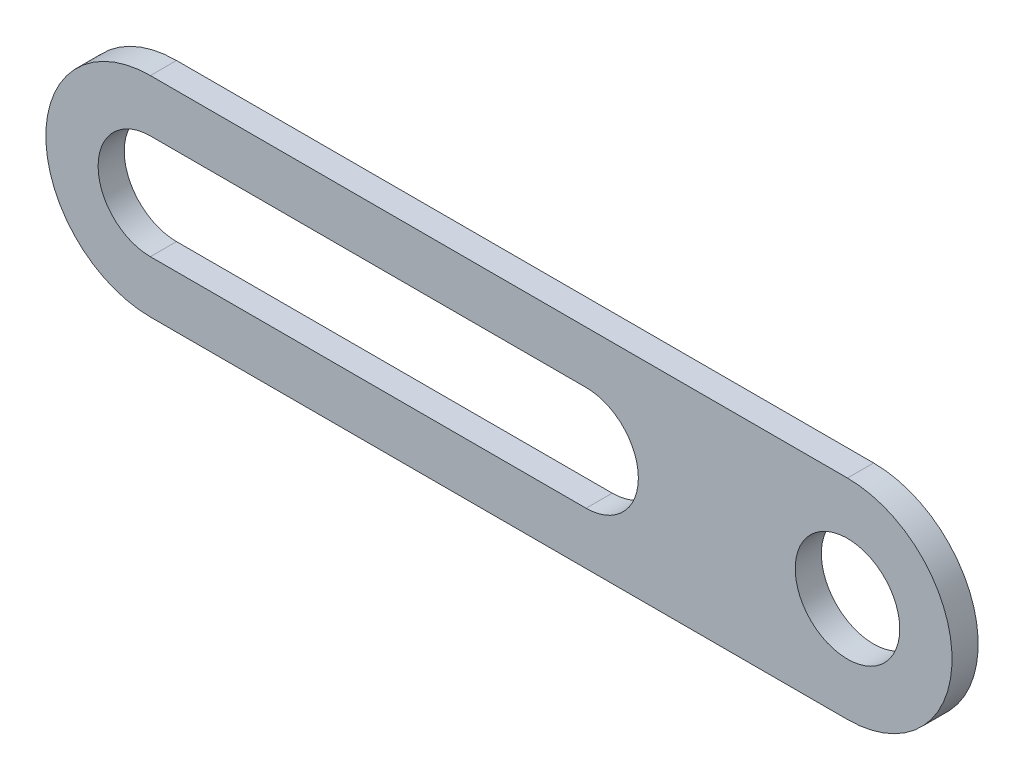
ISO-10303-21;
HEADER;
FILE_DESCRIPTION(('STEP AP214'),'2;1');
FILE_NAME('part.step','',(''),(''),'','','');
FILE_SCHEMA(('AUTOMOTIVE_DESIGN { 1 0 10303 214 1 1 1 1 }'));
ENDSEC;
DATA;
#1=APPLICATION_CONTEXT('core data for automotive mechanical design processes');
#2=APPLICATION_PROTOCOL_DEFINITION('international standard','automotive_design',2000,#1);
#3=PRODUCT_CONTEXT('',#1,'mechanical');
#4=PRODUCT('Part','Part','',(#3));
#5=PRODUCT_RELATED_PRODUCT_CATEGORY('part','',(#4));
#6=PRODUCT_DEFINITION_FORMATION('','',#4);
#7=PRODUCT_DEFINITION_CONTEXT('part definition',#1,'design');
#8=PRODUCT_DEFINITION('design','',#6,#7);
#9=PRODUCT_DEFINITION_SHAPE('','',#8);
#10=(LENGTH_UNIT() NAMED_UNIT(*) SI_UNIT(.MILLI.,.METRE.));
#11=(NAMED_UNIT(*) PLANE_ANGLE_UNIT() SI_UNIT($,.RADIAN.));
#12=(NAMED_UNIT(*) SI_UNIT($,.STERADIAN.) SOLID_ANGLE_UNIT());
#13=UNCERTAINTY_MEASURE_WITH_UNIT(LENGTH_MEASURE(1.E-05),#10,'distance_accuracy_value','');
#14=(GEOMETRIC_REPRESENTATION_CONTEXT(3) GLOBAL_UNCERTAINTY_ASSIGNED_CONTEXT((#13)) GLOBAL_UNIT_ASSIGNED_CONTEXT((#10,
#11,#12)) REPRESENTATION_CONTEXT('',''));
#15=CARTESIAN_POINT('',(0.,0.,0.));
#16=DIRECTION('',(0.,0.,1.));
#17=DIRECTION('',(1.,0.,0.));
#18=AXIS2_PLACEMENT_3D('',#15,#16,#17);
#19=CARTESIAN_POINT('',(-69.3749999999997,-2.43750000000005,3.));
#20=DIRECTION('',(0.,0.,1.));
#21=DIRECTION('',(1.,0.,0.));
#22=AXIS2_PLACEMENT_3D('',#19,#20,#21);
#23=PLANE('',#22);
#24=CARTESIAN_POINT('',(-69.3749999999997,-2.43750000000005,3.));
#25=DIRECTION('',(0.,0.,1.));
#26=DIRECTION('',(1.,0.,0.));
#27=AXIS2_PLACEMENT_3D('',#24,#25,#26);
#28=CIRCLE('',#27,12.);
#29=CARTESIAN_POINT('',(-69.3749999999997,9.56249999999995,3.));
#30=VERTEX_POINT('',#29);
#31=CARTESIAN_POINT('',(-69.3749999999997,-14.4375,3.));
#32=VERTEX_POINT('',#31);
#33=EDGE_CURVE('E140',#30,#32,#28,.T.);
#34=ORIENTED_EDGE('',*,*,#33,.T.);
#35=DIRECTION('',(1.,0.,0.));
#36=VECTOR('',#35,1.);
#37=CARTESIAN_POINT('',(10.6250000000003,-14.4375,3.));
#38=LINE('',#37,#36);
#39=CARTESIAN_POINT('',(10.6250000000003,-14.4375,3.));
#40=VERTEX_POINT('',#39);
#41=EDGE_CURVE('E143',#32,#40,#38,.T.);
#42=ORIENTED_EDGE('',*,*,#41,.T.);
#43=CARTESIAN_POINT('',(10.6250000000003,-2.43750000000005,3.));
#44=DIRECTION('',(0.,0.,1.));
#45=DIRECTION('',(1.,0.,0.));
#46=AXIS2_PLACEMENT_3D('',#43,#44,#45);
#47=CIRCLE('',#46,12.);
#48=CARTESIAN_POINT('',(10.6250000000003,9.56249999999995,3.));
#49=VERTEX_POINT('',#48);
#50=EDGE_CURVE('E146',#40,#49,#47,.T.);
#51=ORIENTED_EDGE('',*,*,#50,.T.);
#52=DIRECTION('',(-1.,0.,0.));
#53=VECTOR('',#52,1.);
#54=CARTESIAN_POINT('',(-69.3749999999997,9.56249999999995,3.));
#55=LINE('',#54,#53);
#56=EDGE_CURVE('E148',#49,#30,#55,.T.);
#57=ORIENTED_EDGE('',*,*,#56,.T.);
#58=EDGE_LOOP('',(#34,#42,#51,#57));
#59=FACE_BOUND('',#58,.T.);
#60=CARTESIAN_POINT('',(10.6250000000003,-2.43750000000005,3.));
#61=DIRECTION('',(0.,0.,1.));
#62=DIRECTION('',(1.,0.,0.));
#63=AXIS2_PLACEMENT_3D('',#60,#61,#62);
#64=CIRCLE('',#63,5.99999999999999);
#65=CARTESIAN_POINT('',(16.6250000000003,-2.43750000000005,3.));
#66=VERTEX_POINT('',#65);
#67=EDGE_CURVE('E134',#66,#66,#64,.T.);
#68=ORIENTED_EDGE('',*,*,#67,.F.);
#69=EDGE_LOOP('',(#68));
#70=FACE_BOUND('',#69,.T.);
#71=DIRECTION('',(1.,0.,0.));
#72=VECTOR('',#71,1.);
#73=CARTESIAN_POINT('',(-69.3749999999997,-8.43750000000005,3.));
#74=LINE('',#73,#72);
#75=CARTESIAN_POINT('',(-69.3749999999997,-8.43750000000005,3.));
#76=VERTEX_POINT('',#75);
#77=CARTESIAN_POINT('',(-19.3749999999997,-8.43750000000005,3.));
#78=VERTEX_POINT('',#77);
#79=EDGE_CURVE('E106',#76,#78,#74,.T.);
#80=ORIENTED_EDGE('',*,*,#79,.F.);
#81=CARTESIAN_POINT('',(-69.3749999999997,-2.43750000000005,3.));
#82=DIRECTION('',(0.,0.,1.));
#83=DIRECTION('',(1.,0.,0.));
#84=AXIS2_PLACEMENT_3D('',#81,#82,#83);
#85=CIRCLE('',#84,6.);
#86=CARTESIAN_POINT('',(-69.3749999999997,3.56249999999995,3.));
#87=VERTEX_POINT('',#86);
#88=EDGE_CURVE('E98',#87,#76,#85,.T.);
#89=ORIENTED_EDGE('',*,*,#88,.F.);
#90=DIRECTION('',(-1.,0.,0.));
#91=VECTOR('',#90,1.);
#92=CARTESIAN_POINT('',(-69.3749999999997,3.56249999999995,3.));
#93=LINE('',#92,#91);
#94=CARTESIAN_POINT('',(-19.3749999999997,3.56249999999995,3.));
#95=VERTEX_POINT('',#94);
#96=EDGE_CURVE('E120',#95,#87,#93,.T.);
#97=ORIENTED_EDGE('',*,*,#96,.F.);
#98=CARTESIAN_POINT('',(-19.3749999999997,-2.43750000000005,3.));
#99=DIRECTION('',(0.,0.,1.));
#100=DIRECTION('',(-1.,0.,0.));
#101=AXIS2_PLACEMENT_3D('',#98,#99,#100);
#102=CIRCLE('',#101,6.);
#103=EDGE_CURVE('E118',#78,#95,#102,.T.);
#104=ORIENTED_EDGE('',*,*,#103,.F.);
#105=EDGE_LOOP('',(#80,#89,#97,#104));
#106=FACE_BOUND('',#105,.T.);
#107=ADVANCED_FACE('F33',(#59,#70,#106),#23,.T.);
#108=CARTESIAN_POINT('',(-69.3749999999997,-2.43750000000005,0.));
#109=DIRECTION('',(0.,0.,1.));
#110=DIRECTION('',(1.,0.,0.));
#111=AXIS2_PLACEMENT_3D('',#108,#109,#110);
#112=PLANE('',#111);
#113=CARTESIAN_POINT('',(10.6250000000003,-2.43750000000005,0.));
#114=DIRECTION('',(0.,0.,1.));
#115=DIRECTION('',(1.,0.,0.));
#116=AXIS2_PLACEMENT_3D('',#113,#114,#115);
#117=CIRCLE('',#116,5.99999999999999);
#118=CARTESIAN_POINT('',(16.6250000000003,-2.43750000000005,0.));
#119=VERTEX_POINT('',#118);
#120=EDGE_CURVE('E114',#119,#119,#117,.T.);
#121=ORIENTED_EDGE('',*,*,#120,.T.);
#122=EDGE_LOOP('',(#121));
#123=FACE_BOUND('',#122,.T.);
#124=CARTESIAN_POINT('',(-69.3749999999997,-2.43750000000005,0.));
#125=DIRECTION('',(0.,0.,1.));
#126=DIRECTION('',(1.,0.,0.));
#127=AXIS2_PLACEMENT_3D('',#124,#125,#126);
#128=CIRCLE('',#127,12.);
#129=CARTESIAN_POINT('',(-69.3749999999997,9.56249999999995,0.));
#130=VERTEX_POINT('',#129);
#131=CARTESIAN_POINT('',(-69.3749999999997,-14.4375,0.));
#132=VERTEX_POINT('',#131);
#133=EDGE_CURVE('E137',#130,#132,#128,.T.);
#134=ORIENTED_EDGE('',*,*,#133,.F.);
#135=DIRECTION('',(-1.,0.,0.));
#136=VECTOR('',#135,1.);
#137=CARTESIAN_POINT('',(-69.3749999999997,9.56249999999995,0.));
#138=LINE('',#137,#136);
#139=CARTESIAN_POINT('',(10.6250000000003,9.56249999999995,0.));
#140=VERTEX_POINT('',#139);
#141=EDGE_CURVE('E144',#140,#130,#138,.T.);
#142=ORIENTED_EDGE('',*,*,#141,.F.);
#143=CARTESIAN_POINT('',(10.6250000000003,-2.43750000000005,0.));
#144=DIRECTION('',(0.,0.,1.));
#145=DIRECTION('',(1.,0.,0.));
#146=AXIS2_PLACEMENT_3D('',#143,#144,#145);
#147=CIRCLE('',#146,12.);
#148=CARTESIAN_POINT('',(10.6250000000003,-14.4375,0.));
#149=VERTEX_POINT('',#148);
#150=EDGE_CURVE('E155',#149,#140,#147,.T.);
#151=ORIENTED_EDGE('',*,*,#150,.F.);
#152=DIRECTION('',(1.,0.,0.));
#153=VECTOR('',#152,1.);
#154=CARTESIAN_POINT('',(10.6250000000003,-14.4375,0.));
#155=LINE('',#154,#153);
#156=EDGE_CURVE('E153',#132,#149,#155,.T.);
#157=ORIENTED_EDGE('',*,*,#156,.F.);
#158=EDGE_LOOP('',(#134,#142,#151,#157));
#159=FACE_BOUND('',#158,.T.);
#160=CARTESIAN_POINT('',(-69.3749999999997,-2.43750000000005,0.));
#161=DIRECTION('',(0.,0.,1.));
#162=DIRECTION('',(1.,0.,0.));
#163=AXIS2_PLACEMENT_3D('',#160,#161,#162);
#164=CIRCLE('',#163,6.);
#165=CARTESIAN_POINT('',(-69.3749999999997,3.56249999999995,0.));
#166=VERTEX_POINT('',#165);
#167=CARTESIAN_POINT('',(-69.3749999999997,-8.43750000000005,0.));
#168=VERTEX_POINT('',#167);
#169=EDGE_CURVE('E56',#166,#168,#164,.T.);
#170=ORIENTED_EDGE('',*,*,#169,.T.);
#171=DIRECTION('',(1.,0.,0.));
#172=VECTOR('',#171,1.);
#173=CARTESIAN_POINT('',(-69.3749999999997,-8.43750000000005,0.));
#174=LINE('',#173,#172);
#175=CARTESIAN_POINT('',(-19.3749999999997,-8.43750000000005,0.));
#176=VERTEX_POINT('',#175);
#177=EDGE_CURVE('E113',#168,#176,#174,.T.);
#178=ORIENTED_EDGE('',*,*,#177,.T.);
#179=CARTESIAN_POINT('',(-19.3749999999997,-2.43750000000005,0.));
#180=DIRECTION('',(0.,0.,1.));
#181=DIRECTION('',(-1.,0.,0.));
#182=AXIS2_PLACEMENT_3D('',#179,#180,#181);
#183=CIRCLE('',#182,6.);
#184=CARTESIAN_POINT('',(-19.3749999999997,3.56249999999995,0.));
#185=VERTEX_POINT('',#184);
#186=EDGE_CURVE('E126',#176,#185,#183,.T.);
#187=ORIENTED_EDGE('',*,*,#186,.T.);
#188=DIRECTION('',(-1.,0.,0.));
#189=VECTOR('',#188,1.);
#190=CARTESIAN_POINT('',(-69.3749999999997,3.56249999999995,0.));
#191=LINE('',#190,#189);
#192=EDGE_CURVE('E107',#185,#166,#191,.T.);
#193=ORIENTED_EDGE('',*,*,#192,.T.);
#194=EDGE_LOOP('',(#170,#178,#187,#193));
#195=FACE_BOUND('',#194,.T.);
#196=ADVANCED_FACE('F173',(#123,#159,#195),#112,.F.);
#197=CARTESIAN_POINT('',(-69.3749999999997,-2.43750000000005,3.));
#198=DIRECTION('',(0.,0.,-1.));
#199=DIRECTION('',(-1.,0.,0.));
#200=AXIS2_PLACEMENT_3D('',#197,#198,#199);
#201=CYLINDRICAL_SURFACE('',#200,12.);
#202=ORIENTED_EDGE('',*,*,#133,.T.);
#203=DIRECTION('',(0.,0.,-1.));
#204=VECTOR('',#203,1.);
#205=CARTESIAN_POINT('',(-69.3749999999997,-14.4375,3.));
#206=LINE('',#205,#204);
#207=EDGE_CURVE('E11',#32,#132,#206,.T.);
#208=ORIENTED_EDGE('',*,*,#207,.F.);
#209=ORIENTED_EDGE('',*,*,#33,.F.);
#210=DIRECTION('',(0.,0.,-1.));
#211=VECTOR('',#210,1.);
#212=CARTESIAN_POINT('',(-69.3749999999997,9.56249999999995,3.));
#213=LINE('',#212,#211);
#214=EDGE_CURVE('E150',#30,#130,#213,.T.);
#215=ORIENTED_EDGE('',*,*,#214,.T.);
#216=EDGE_LOOP('',(#202,#208,#209,#215));
#217=FACE_BOUND('',#216,.T.);
#218=ADVANCED_FACE('F35',(#217),#201,.T.);
#219=CARTESIAN_POINT('',(10.6250000000003,-14.4375,3.));
#220=DIRECTION('',(0.,1.,0.));
#221=DIRECTION('',(-1.,0.,0.));
#222=AXIS2_PLACEMENT_3D('',#219,#220,#221);
#223=PLANE('',#222);
#224=ORIENTED_EDGE('',*,*,#156,.T.);
#225=DIRECTION('',(0.,0.,-1.));
#226=VECTOR('',#225,1.);
#227=CARTESIAN_POINT('',(10.6250000000003,-14.4375,3.));
#228=LINE('',#227,#226);
#229=EDGE_CURVE('E41',#40,#149,#228,.T.);
#230=ORIENTED_EDGE('',*,*,#229,.F.);
#231=ORIENTED_EDGE('',*,*,#41,.F.);
#232=ORIENTED_EDGE('',*,*,#207,.T.);
#233=EDGE_LOOP('',(#224,#230,#231,#232));
#234=FACE_BOUND('',#233,.T.);
#235=ADVANCED_FACE('F184',(#234),#223,.F.);
#236=CARTESIAN_POINT('',(10.6250000000003,-2.43750000000005,3.));
#237=DIRECTION('',(0.,0.,-1.));
#238=DIRECTION('',(-1.,0.,0.));
#239=AXIS2_PLACEMENT_3D('',#236,#237,#238);
#240=CYLINDRICAL_SURFACE('',#239,12.);
#241=ORIENTED_EDGE('',*,*,#150,.T.);
#242=DIRECTION('',(0.,0.,-1.));
#243=VECTOR('',#242,1.);
#244=CARTESIAN_POINT('',(10.6250000000003,9.56249999999995,3.));
#245=LINE('',#244,#243);
#246=EDGE_CURVE('E160',#49,#140,#245,.T.);
#247=ORIENTED_EDGE('',*,*,#246,.F.);
#248=ORIENTED_EDGE('',*,*,#50,.F.);
#249=ORIENTED_EDGE('',*,*,#229,.T.);
#250=EDGE_LOOP('',(#241,#247,#248,#249));
#251=FACE_BOUND('',#250,.T.);
#252=ADVANCED_FACE('F167',(#251),#240,.T.);
#253=CARTESIAN_POINT('',(-69.3749999999997,9.56249999999995,3.));
#254=DIRECTION('',(0.,-1.,0.));
#255=DIRECTION('',(0.,0.,-1.));
#256=AXIS2_PLACEMENT_3D('',#253,#254,#255);
#257=PLANE('',#256);
#258=ORIENTED_EDGE('',*,*,#141,.T.);
#259=ORIENTED_EDGE('',*,*,#214,.F.);
#260=ORIENTED_EDGE('',*,*,#56,.F.);
#261=ORIENTED_EDGE('',*,*,#246,.T.);
#262=EDGE_LOOP('',(#258,#259,#260,#261));
#263=FACE_BOUND('',#262,.T.);
#264=ADVANCED_FACE('F177',(#263),#257,.F.);
#265=CARTESIAN_POINT('',(10.6250000000003,-2.43750000000005,3.));
#266=DIRECTION('',(0.,0.,-1.));
#267=DIRECTION('',(-1.,0.,0.));
#268=AXIS2_PLACEMENT_3D('',#265,#266,#267);
#269=CYLINDRICAL_SURFACE('',#268,5.99999999999999);
#270=ORIENTED_EDGE('',*,*,#67,.T.);
#271=EDGE_LOOP('',(#270));
#272=FACE_BOUND('',#271,.T.);
#273=ORIENTED_EDGE('',*,*,#120,.F.);
#274=EDGE_LOOP('',(#273));
#275=FACE_BOUND('',#274,.T.);
#276=ADVANCED_FACE('F199',(#272,#275),#269,.F.);
#277=CARTESIAN_POINT('',(-69.3749999999997,-2.43750000000005,3.));
#278=DIRECTION('',(0.,0.,-1.));
#279=DIRECTION('',(-1.,0.,0.));
#280=AXIS2_PLACEMENT_3D('',#277,#278,#279);
#281=CYLINDRICAL_SURFACE('',#280,6.);
#282=ORIENTED_EDGE('',*,*,#169,.F.);
#283=DIRECTION('',(0.,0.,-1.));
#284=VECTOR('',#283,1.);
#285=CARTESIAN_POINT('',(-69.3749999999997,3.56249999999995,3.));
#286=LINE('',#285,#284);
#287=EDGE_CURVE('E102',#87,#166,#286,.T.);
#288=ORIENTED_EDGE('',*,*,#287,.F.);
#289=ORIENTED_EDGE('',*,*,#88,.T.);
#290=DIRECTION('',(0.,0.,-1.));
#291=VECTOR('',#290,1.);
#292=CARTESIAN_POINT('',(-69.3749999999997,-8.43750000000005,3.));
#293=LINE('',#292,#291);
#294=EDGE_CURVE('E101',#76,#168,#293,.T.);
#295=ORIENTED_EDGE('',*,*,#294,.T.);
#296=EDGE_LOOP('',(#282,#288,#289,#295));
#297=FACE_BOUND('',#296,.T.);
#298=ADVANCED_FACE('F100',(#297),#281,.F.);
#299=CARTESIAN_POINT('',(-69.3749999999997,-8.43750000000005,3.));
#300=DIRECTION('',(0.,1.,0.));
#301=DIRECTION('',(0.,0.,1.));
#302=AXIS2_PLACEMENT_3D('',#299,#300,#301);
#303=PLANE('',#302);
#304=ORIENTED_EDGE('',*,*,#177,.F.);
#305=ORIENTED_EDGE('',*,*,#294,.F.);
#306=ORIENTED_EDGE('',*,*,#79,.T.);
#307=DIRECTION('',(0.,0.,-1.));
#308=VECTOR('',#307,1.);
#309=CARTESIAN_POINT('',(-19.3749999999997,-8.43750000000005,3.));
#310=LINE('',#309,#308);
#311=EDGE_CURVE('E115',#78,#176,#310,.T.);
#312=ORIENTED_EDGE('',*,*,#311,.T.);
#313=EDGE_LOOP('',(#304,#305,#306,#312));
#314=FACE_BOUND('',#313,.T.);
#315=ADVANCED_FACE('F110',(#314),#303,.T.);
#316=CARTESIAN_POINT('',(-19.3749999999997,-2.43750000000005,3.));
#317=DIRECTION('',(0.,0.,-1.));
#318=DIRECTION('',(-1.,0.,0.));
#319=AXIS2_PLACEMENT_3D('',#316,#317,#318);
#320=CYLINDRICAL_SURFACE('',#319,6.);
#321=ORIENTED_EDGE('',*,*,#186,.F.);
#322=ORIENTED_EDGE('',*,*,#311,.F.);
#323=ORIENTED_EDGE('',*,*,#103,.T.);
#324=DIRECTION('',(0.,0.,-1.));
#325=VECTOR('',#324,1.);
#326=CARTESIAN_POINT('',(-19.3749999999997,3.56249999999995,3.));
#327=LINE('',#326,#325);
#328=EDGE_CURVE('E48',#95,#185,#327,.T.);
#329=ORIENTED_EDGE('',*,*,#328,.T.);
#330=EDGE_LOOP('',(#321,#322,#323,#329));
#331=FACE_BOUND('',#330,.T.);
#332=ADVANCED_FACE('F216',(#331),#320,.F.);
#333=CARTESIAN_POINT('',(-69.3749999999997,3.56249999999995,3.));
#334=DIRECTION('',(0.,-1.,0.));
#335=DIRECTION('',(1.,0.,0.));
#336=AXIS2_PLACEMENT_3D('',#333,#334,#335);
#337=PLANE('',#336);
#338=ORIENTED_EDGE('',*,*,#192,.F.);
#339=ORIENTED_EDGE('',*,*,#328,.F.);
#340=ORIENTED_EDGE('',*,*,#96,.T.);
#341=ORIENTED_EDGE('',*,*,#287,.T.);
#342=EDGE_LOOP('',(#338,#339,#340,#341));
#343=FACE_BOUND('',#342,.T.);
#344=ADVANCED_FACE('F221',(#343),#337,.T.);
#345=CLOSED_SHELL('',(#107,#196,#218,#235,#252,#264,#276,#298,#315,#332,#344));
#346=MANIFOLD_SOLID_BREP('B2',#345);
#347=ADVANCED_BREP_SHAPE_REPRESENTATION('',(#18,#346),#14);
#348=SHAPE_DEFINITION_REPRESENTATION(#9,#347);
ENDSEC;
END-ISO-10303-21;
